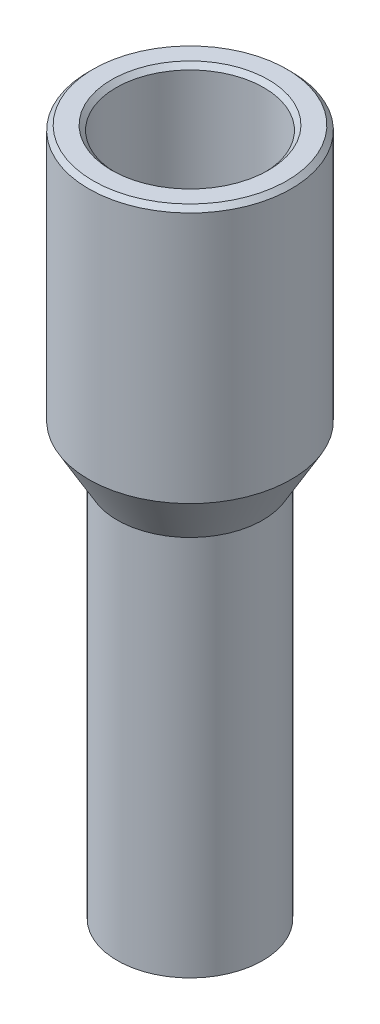
ISO-10303-21;
HEADER;
FILE_DESCRIPTION(('STEP AP214'),'2;1');
FILE_NAME('part.step','',(''),(''),'','','');
FILE_SCHEMA(('AUTOMOTIVE_DESIGN { 1 0 10303 214 1 1 1 1 }'));
ENDSEC;
DATA;
#1=APPLICATION_CONTEXT('core data for automotive mechanical design processes');
#2=APPLICATION_PROTOCOL_DEFINITION('international standard','automotive_design',2000,#1);
#3=PRODUCT_CONTEXT('',#1,'mechanical');
#4=PRODUCT('Part','Part','',(#3));
#5=PRODUCT_RELATED_PRODUCT_CATEGORY('part','',(#4));
#6=PRODUCT_DEFINITION_FORMATION('','',#4);
#7=PRODUCT_DEFINITION_CONTEXT('part definition',#1,'design');
#8=PRODUCT_DEFINITION('design','',#6,#7);
#9=PRODUCT_DEFINITION_SHAPE('','',#8);
#10=(LENGTH_UNIT() NAMED_UNIT(*) SI_UNIT(.MILLI.,.METRE.));
#11=(NAMED_UNIT(*) PLANE_ANGLE_UNIT() SI_UNIT($,.RADIAN.));
#12=(NAMED_UNIT(*) SI_UNIT($,.STERADIAN.) SOLID_ANGLE_UNIT());
#13=UNCERTAINTY_MEASURE_WITH_UNIT(LENGTH_MEASURE(1.E-05),#10,'distance_accuracy_value','');
#14=(GEOMETRIC_REPRESENTATION_CONTEXT(3) GLOBAL_UNCERTAINTY_ASSIGNED_CONTEXT((#13)) GLOBAL_UNIT_ASSIGNED_CONTEXT((#10,
#11,#12)) REPRESENTATION_CONTEXT('',''));
#15=CARTESIAN_POINT('',(0.,0.,0.));
#16=DIRECTION('',(0.,0.,1.));
#17=DIRECTION('',(1.,0.,0.));
#18=AXIS2_PLACEMENT_3D('',#15,#16,#17);
#19=CARTESIAN_POINT('',(6.35,0.,0.));
#20=DIRECTION('',(0.,-1.,0.));
#21=DIRECTION('',(0.,0.,-1.));
#22=AXIS2_PLACEMENT_3D('',#19,#20,#21);
#23=PLANE('',#22);
#24=CARTESIAN_POINT('',(0.,0.,0.));
#25=DIRECTION('',(0.,-1.,0.));
#26=DIRECTION('',(0.,0.,-1.));
#27=AXIS2_PLACEMENT_3D('',#24,#25,#26);
#28=CIRCLE('',#27,6.35);
#29=CARTESIAN_POINT('',(0.,0.,-6.35));
#30=VERTEX_POINT('',#29);
#31=EDGE_CURVE('E82',#30,#30,#28,.T.);
#32=ORIENTED_EDGE('',*,*,#31,.T.);
#33=EDGE_LOOP('',(#32));
#34=FACE_BOUND('',#33,.T.);
#35=ADVANCED_FACE('F45',(#34),#23,.T.);
#36=CARTESIAN_POINT('',(0.,40.,0.));
#37=DIRECTION('',(0.,1.,0.));
#38=DIRECTION('',(0.,0.,1.));
#39=AXIS2_PLACEMENT_3D('',#36,#37,#38);
#40=PLANE('',#39);
#41=CARTESIAN_POINT('',(0.,40.,0.));
#42=DIRECTION('',(0.,-1.,0.));
#43=DIRECTION('',(0.,0.,-1.));
#44=AXIS2_PLACEMENT_3D('',#41,#42,#43);
#45=CIRCLE('',#44,6.45);
#46=CARTESIAN_POINT('',(0.,40.,-6.45));
#47=VERTEX_POINT('',#46);
#48=EDGE_CURVE('E70',#47,#47,#45,.T.);
#49=ORIENTED_EDGE('',*,*,#48,.F.);
#50=EDGE_LOOP('',(#49));
#51=FACE_BOUND('',#50,.T.);
#52=ADVANCED_FACE('F104',(#51),#40,.T.);
#53=CARTESIAN_POINT('',(0.,0.,0.));
#54=DIRECTION('',(0.,-1.,0.));
#55=DIRECTION('',(0.,0.,-1.));
#56=AXIS2_PLACEMENT_3D('',#53,#54,#55);
#57=CYLINDRICAL_SURFACE('',#56,6.45);
#58=CARTESIAN_POINT('',(0.,59.6,0.));
#59=DIRECTION('',(0.,1.,0.));
#60=DIRECTION('',(0.,0.,1.));
#61=AXIS2_PLACEMENT_3D('',#58,#59,#60);
#62=CIRCLE('',#61,6.45);
#63=CARTESIAN_POINT('',(0.,59.6,6.45));
#64=VERTEX_POINT('',#63);
#65=EDGE_CURVE('E10',#64,#64,#62,.T.);
#66=ORIENTED_EDGE('',*,*,#65,.T.);
#67=EDGE_LOOP('',(#66));
#68=FACE_BOUND('',#67,.T.);
#69=ORIENTED_EDGE('',*,*,#48,.T.);
#70=EDGE_LOOP('',(#69));
#71=FACE_BOUND('',#70,.T.);
#72=ADVANCED_FACE('F109',(#68,#71),#57,.F.);
#73=CARTESIAN_POINT('',(6.45,60.,0.));
#74=DIRECTION('',(0.,1.,0.));
#75=DIRECTION('',(0.,0.,1.));
#76=AXIS2_PLACEMENT_3D('',#73,#74,#75);
#77=PLANE('',#76);
#78=CARTESIAN_POINT('',(0.,60.,0.));
#79=DIRECTION('',(0.,1.,0.));
#80=DIRECTION('',(0.,0.,1.));
#81=AXIS2_PLACEMENT_3D('',#78,#79,#80);
#82=CIRCLE('',#81,8.45);
#83=CARTESIAN_POINT('',(0.,60.,8.45));
#84=VERTEX_POINT('',#83);
#85=EDGE_CURVE('E54',#84,#84,#82,.T.);
#86=ORIENTED_EDGE('',*,*,#85,.T.);
#87=EDGE_LOOP('',(#86));
#88=FACE_BOUND('',#87,.T.);
#89=CARTESIAN_POINT('',(0.,60.,0.));
#90=DIRECTION('',(0.,1.,0.));
#91=DIRECTION('',(0.,0.,1.));
#92=AXIS2_PLACEMENT_3D('',#89,#90,#91);
#93=CIRCLE('',#92,6.85);
#94=CARTESIAN_POINT('',(0.,60.,6.85));
#95=VERTEX_POINT('',#94);
#96=EDGE_CURVE('E59',#95,#95,#93,.F.);
#97=ORIENTED_EDGE('',*,*,#96,.T.);
#98=EDGE_LOOP('',(#97));
#99=FACE_BOUND('',#98,.T.);
#100=ADVANCED_FACE('F119',(#88,#99),#77,.T.);
#101=CARTESIAN_POINT('',(0.,0.,0.));
#102=DIRECTION('',(0.,-1.,0.));
#103=DIRECTION('',(0.,0.,-1.));
#104=AXIS2_PLACEMENT_3D('',#101,#102,#103);
#105=CYLINDRICAL_SURFACE('',#104,8.85);
#106=CARTESIAN_POINT('',(0.,59.6,0.));
#107=DIRECTION('',(0.,1.,0.));
#108=DIRECTION('',(0.,0.,1.));
#109=AXIS2_PLACEMENT_3D('',#106,#107,#108);
#110=CIRCLE('',#109,8.85);
#111=CARTESIAN_POINT('',(0.,59.6,8.85));
#112=VERTEX_POINT('',#111);
#113=EDGE_CURVE('E64',#112,#112,#110,.F.);
#114=ORIENTED_EDGE('',*,*,#113,.T.);
#115=EDGE_LOOP('',(#114));
#116=FACE_BOUND('',#115,.T.);
#117=CARTESIAN_POINT('',(0.,37.6286496469846,0.));
#118=DIRECTION('',(0.,-1.,0.));
#119=DIRECTION('',(0.,0.,-1.));
#120=AXIS2_PLACEMENT_3D('',#117,#118,#119);
#121=CIRCLE('',#120,8.85);
#122=CARTESIAN_POINT('',(0.,37.6286496469846,-8.85));
#123=VERTEX_POINT('',#122);
#124=EDGE_CURVE('E74',#123,#123,#121,.T.);
#125=ORIENTED_EDGE('',*,*,#124,.F.);
#126=EDGE_LOOP('',(#125));
#127=FACE_BOUND('',#126,.T.);
#128=ADVANCED_FACE('F100',(#116,#127),#105,.T.);
#129=CARTESIAN_POINT('',(0.,33.2985226280624,0.));
#130=DIRECTION('',(0.,1.,0.));
#131=DIRECTION('',(0.,0.,1.));
#132=AXIS2_PLACEMENT_3D('',#129,#130,#131);
#133=CONICAL_SURFACE('',#132,6.35,0.523598775598301);
#134=ORIENTED_EDGE('',*,*,#124,.T.);
#135=EDGE_LOOP('',(#134));
#136=FACE_BOUND('',#135,.T.);
#137=CARTESIAN_POINT('',(0.,33.2985226280624,0.));
#138=DIRECTION('',(0.,-1.,0.));
#139=DIRECTION('',(0.,0.,-1.));
#140=AXIS2_PLACEMENT_3D('',#137,#138,#139);
#141=CIRCLE('',#140,6.35);
#142=CARTESIAN_POINT('',(0.,33.2985226280624,-6.35));
#143=VERTEX_POINT('',#142);
#144=EDGE_CURVE('E78',#143,#143,#141,.T.);
#145=ORIENTED_EDGE('',*,*,#144,.F.);
#146=EDGE_LOOP('',(#145));
#147=FACE_BOUND('',#146,.T.);
#148=ADVANCED_FACE('F91',(#136,#147),#133,.T.);
#149=CARTESIAN_POINT('',(0.,0.,0.));
#150=DIRECTION('',(0.,-1.,0.));
#151=DIRECTION('',(0.,0.,-1.));
#152=AXIS2_PLACEMENT_3D('',#149,#150,#151);
#153=CYLINDRICAL_SURFACE('',#152,6.35);
#154=ORIENTED_EDGE('',*,*,#144,.T.);
#155=EDGE_LOOP('',(#154));
#156=FACE_BOUND('',#155,.T.);
#157=ORIENTED_EDGE('',*,*,#31,.F.);
#158=EDGE_LOOP('',(#157));
#159=FACE_BOUND('',#158,.T.);
#160=ADVANCED_FACE('F88',(#156,#159),#153,.T.);
#161=CARTESIAN_POINT('',(0.,59.6,0.));
#162=DIRECTION('',(0.,-1.,0.));
#163=DIRECTION('',(0.,0.,-1.));
#164=AXIS2_PLACEMENT_3D('',#161,#162,#163);
#165=CONICAL_SURFACE('',#164,8.85,0.785398163397446);
#166=ORIENTED_EDGE('',*,*,#85,.F.);
#167=EDGE_LOOP('',(#166));
#168=FACE_BOUND('',#167,.T.);
#169=ORIENTED_EDGE('',*,*,#113,.F.);
#170=EDGE_LOOP('',(#169));
#171=FACE_BOUND('',#170,.T.);
#172=ADVANCED_FACE('F90',(#168,#171),#165,.T.);
#173=CARTESIAN_POINT('',(0.,60.,0.));
#174=DIRECTION('',(0.,1.,0.));
#175=DIRECTION('',(0.,0.,1.));
#176=AXIS2_PLACEMENT_3D('',#173,#174,#175);
#177=CONICAL_SURFACE('',#176,6.85,0.785398163397446);
#178=ORIENTED_EDGE('',*,*,#65,.F.);
#179=EDGE_LOOP('',(#178));
#180=FACE_BOUND('',#179,.T.);
#181=ORIENTED_EDGE('',*,*,#96,.F.);
#182=EDGE_LOOP('',(#181));
#183=FACE_BOUND('',#182,.T.);
#184=ADVANCED_FACE('F48',(#180,#183),#177,.F.);
#185=CLOSED_SHELL('',(#35,#52,#72,#100,#128,#148,#160,#172,#184));
#186=MANIFOLD_SOLID_BREP('B2',#185);
#187=ADVANCED_BREP_SHAPE_REPRESENTATION('',(#18,#186),#14);
#188=SHAPE_DEFINITION_REPRESENTATION(#9,#187);
ENDSEC;
END-ISO-10303-21;
